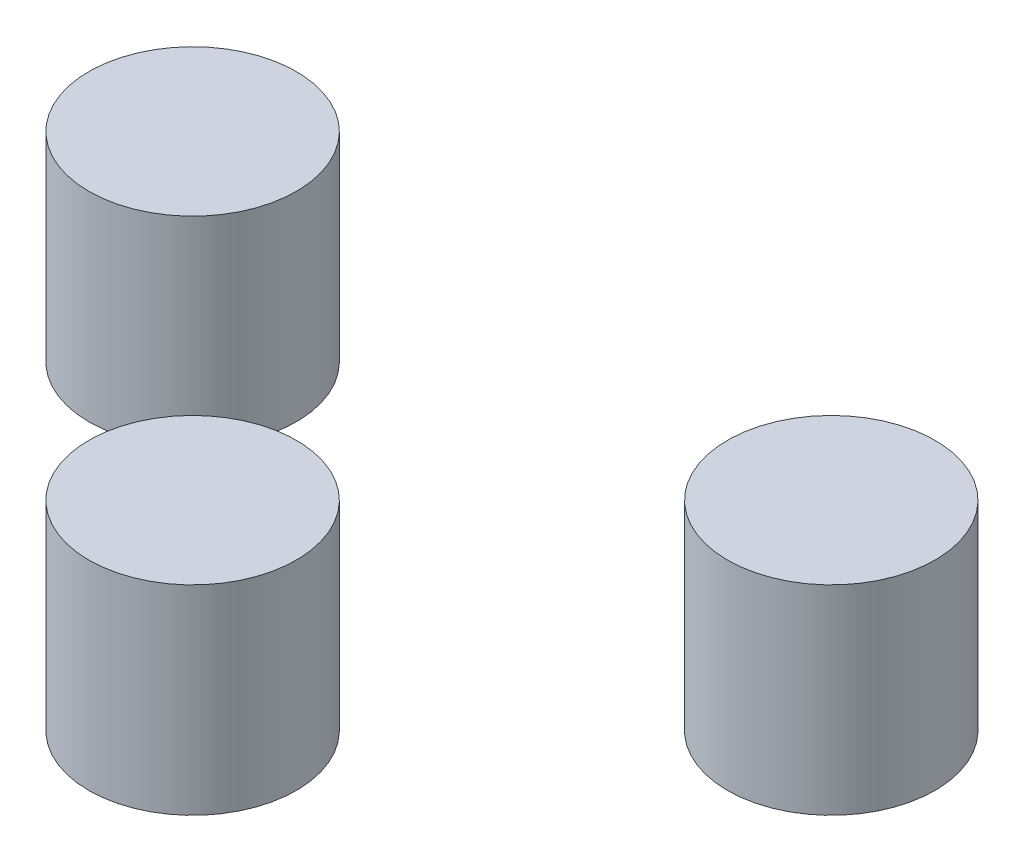
ISO-10303-21;
HEADER;
FILE_DESCRIPTION(('STEP AP214'),'2;1');
FILE_NAME('part.step','',(''),(''),'','','');
FILE_SCHEMA(('AUTOMOTIVE_DESIGN { 1 0 10303 214 1 1 1 1 }'));
ENDSEC;
DATA;
#1=APPLICATION_CONTEXT('core data for automotive mechanical design processes');
#2=APPLICATION_PROTOCOL_DEFINITION('international standard','automotive_design',2000,#1);
#3=PRODUCT_CONTEXT('',#1,'mechanical');
#4=PRODUCT('Part','Part','',(#3));
#5=PRODUCT_RELATED_PRODUCT_CATEGORY('part','',(#4));
#6=PRODUCT_DEFINITION_FORMATION('','',#4);
#7=PRODUCT_DEFINITION_CONTEXT('part definition',#1,'design');
#8=PRODUCT_DEFINITION('design','',#6,#7);
#9=PRODUCT_DEFINITION_SHAPE('','',#8);
#10=(LENGTH_UNIT() NAMED_UNIT(*) SI_UNIT(.MILLI.,.METRE.));
#11=(NAMED_UNIT(*) PLANE_ANGLE_UNIT() SI_UNIT($,.RADIAN.));
#12=(NAMED_UNIT(*) SI_UNIT($,.STERADIAN.) SOLID_ANGLE_UNIT());
#13=UNCERTAINTY_MEASURE_WITH_UNIT(LENGTH_MEASURE(1.E-05),#10,'distance_accuracy_value','');
#14=(GEOMETRIC_REPRESENTATION_CONTEXT(3) GLOBAL_UNCERTAINTY_ASSIGNED_CONTEXT((#13)) GLOBAL_UNIT_ASSIGNED_CONTEXT((#10,
#11,#12)) REPRESENTATION_CONTEXT('',''));
#15=CARTESIAN_POINT('',(0.,0.,0.));
#16=DIRECTION('',(0.,0.,1.));
#17=DIRECTION('',(1.,0.,0.));
#18=AXIS2_PLACEMENT_3D('',#15,#16,#17);
#19=CARTESIAN_POINT('',(0.,44.9999999999999,-1240.));
#20=DIRECTION('',(0.,-1.,0.));
#21=DIRECTION('',(0.,0.,-1.));
#22=AXIS2_PLACEMENT_3D('',#19,#20,#21);
#23=CYLINDRICAL_SURFACE('',#22,130.);
#24=CARTESIAN_POINT('',(0.,44.9999999999999,-1240.));
#25=DIRECTION('',(0.,1.,0.));
#26=DIRECTION('',(0.,0.,1.));
#27=AXIS2_PLACEMENT_3D('',#24,#25,#26);
#28=CIRCLE('',#27,130.);
#29=CARTESIAN_POINT('',(0.,44.9999999999999,-1110.));
#30=VERTEX_POINT('',#29);
#31=EDGE_CURVE('E11',#30,#30,#28,.T.);
#32=ORIENTED_EDGE('',*,*,#31,.F.);
#33=EDGE_LOOP('',(#32));
#34=FACE_BOUND('',#33,.T.);
#35=CARTESIAN_POINT('',(0.,-205.,-1240.));
#36=DIRECTION('',(0.,1.,0.));
#37=DIRECTION('',(0.,0.,1.));
#38=AXIS2_PLACEMENT_3D('',#35,#36,#37);
#39=CIRCLE('',#38,130.);
#40=CARTESIAN_POINT('',(0.,-205.,-1110.));
#41=VERTEX_POINT('',#40);
#42=EDGE_CURVE('E47',#41,#41,#39,.T.);
#43=ORIENTED_EDGE('',*,*,#42,.T.);
#44=EDGE_LOOP('',(#43));
#45=FACE_BOUND('',#44,.T.);
#46=ADVANCED_FACE('F46',(#34,#45),#23,.T.);
#47=CARTESIAN_POINT('',(0.,44.9999999999999,-1240.));
#48=DIRECTION('',(0.,1.,0.));
#49=DIRECTION('',(0.,0.,1.));
#50=AXIS2_PLACEMENT_3D('',#47,#48,#49);
#51=PLANE('',#50);
#52=ORIENTED_EDGE('',*,*,#31,.T.);
#53=EDGE_LOOP('',(#52));
#54=FACE_BOUND('',#53,.T.);
#55=ADVANCED_FACE('F61',(#54),#51,.T.);
#56=CARTESIAN_POINT('',(0.,-205.,-1240.));
#57=DIRECTION('',(0.,1.,0.));
#58=DIRECTION('',(0.,0.,1.));
#59=AXIS2_PLACEMENT_3D('',#56,#57,#58);
#60=PLANE('',#59);
#61=ORIENTED_EDGE('',*,*,#42,.F.);
#62=EDGE_LOOP('',(#61));
#63=FACE_BOUND('',#62,.T.);
#64=ADVANCED_FACE('F56',(#63),#60,.F.);
#65=CLOSED_SHELL('',(#46,#55,#64));
#66=MANIFOLD_SOLID_BREP('B2',#65);
#67=CARTESIAN_POINT('',(400.,44.9999999999999,-1640.));
#68=DIRECTION('',(0.,-1.,0.));
#69=DIRECTION('',(0.,0.,-1.));
#70=AXIS2_PLACEMENT_3D('',#67,#68,#69);
#71=CYLINDRICAL_SURFACE('',#70,130.);
#72=CARTESIAN_POINT('',(400.,44.9999999999999,-1640.));
#73=DIRECTION('',(0.,1.,0.));
#74=DIRECTION('',(0.,0.,1.));
#75=AXIS2_PLACEMENT_3D('',#72,#73,#74);
#76=CIRCLE('',#75,130.);
#77=CARTESIAN_POINT('',(400.,44.9999999999999,-1510.));
#78=VERTEX_POINT('',#77);
#79=EDGE_CURVE('E44',#78,#78,#76,.T.);
#80=ORIENTED_EDGE('',*,*,#79,.F.);
#81=EDGE_LOOP('',(#80));
#82=FACE_BOUND('',#81,.T.);
#83=CARTESIAN_POINT('',(400.,-205.,-1640.));
#84=DIRECTION('',(0.,1.,0.));
#85=DIRECTION('',(0.,0.,1.));
#86=AXIS2_PLACEMENT_3D('',#83,#84,#85);
#87=CIRCLE('',#86,130.);
#88=CARTESIAN_POINT('',(400.,-205.,-1510.));
#89=VERTEX_POINT('',#88);
#90=EDGE_CURVE('E100',#89,#89,#87,.T.);
#91=ORIENTED_EDGE('',*,*,#90,.T.);
#92=EDGE_LOOP('',(#91));
#93=FACE_BOUND('',#92,.T.);
#94=ADVANCED_FACE('F94',(#82,#93),#71,.T.);
#95=CARTESIAN_POINT('',(400.,44.9999999999999,-1640.));
#96=DIRECTION('',(0.,1.,0.));
#97=DIRECTION('',(0.,0.,1.));
#98=AXIS2_PLACEMENT_3D('',#95,#96,#97);
#99=PLANE('',#98);
#100=ORIENTED_EDGE('',*,*,#79,.T.);
#101=EDGE_LOOP('',(#100));
#102=FACE_BOUND('',#101,.T.);
#103=ADVANCED_FACE('F108',(#102),#99,.T.);
#104=CARTESIAN_POINT('',(400.,-205.,-1640.));
#105=DIRECTION('',(0.,1.,0.));
#106=DIRECTION('',(0.,0.,1.));
#107=AXIS2_PLACEMENT_3D('',#104,#105,#106);
#108=PLANE('',#107);
#109=ORIENTED_EDGE('',*,*,#90,.F.);
#110=EDGE_LOOP('',(#109));
#111=FACE_BOUND('',#110,.T.);
#112=ADVANCED_FACE('F110',(#111),#108,.F.);
#113=CLOSED_SHELL('',(#94,#103,#112));
#114=MANIFOLD_SOLID_BREP('B6',#113);
#115=CARTESIAN_POINT('',(-400.,44.9999999999999,-1640.));
#116=DIRECTION('',(0.,-1.,0.));
#117=DIRECTION('',(0.,0.,-1.));
#118=AXIS2_PLACEMENT_3D('',#115,#116,#117);
#119=CYLINDRICAL_SURFACE('',#118,130.);
#120=CARTESIAN_POINT('',(-400.,44.9999999999999,-1640.));
#121=DIRECTION('',(0.,1.,0.));
#122=DIRECTION('',(0.,0.,1.));
#123=AXIS2_PLACEMENT_3D('',#120,#121,#122);
#124=CIRCLE('',#123,130.);
#125=CARTESIAN_POINT('',(-400.,44.9999999999999,-1510.));
#126=VERTEX_POINT('',#125);
#127=EDGE_CURVE('E91',#126,#126,#124,.T.);
#128=ORIENTED_EDGE('',*,*,#127,.F.);
#129=EDGE_LOOP('',(#128));
#130=FACE_BOUND('',#129,.T.);
#131=CARTESIAN_POINT('',(-400.,-205.,-1640.));
#132=DIRECTION('',(0.,1.,0.));
#133=DIRECTION('',(0.,0.,1.));
#134=AXIS2_PLACEMENT_3D('',#131,#132,#133);
#135=CIRCLE('',#134,130.);
#136=CARTESIAN_POINT('',(-400.,-205.,-1510.));
#137=VERTEX_POINT('',#136);
#138=EDGE_CURVE('E139',#137,#137,#135,.T.);
#139=ORIENTED_EDGE('',*,*,#138,.T.);
#140=EDGE_LOOP('',(#139));
#141=FACE_BOUND('',#140,.T.);
#142=ADVANCED_FACE('F134',(#130,#141),#119,.T.);
#143=CARTESIAN_POINT('',(-400.,44.9999999999999,-1640.));
#144=DIRECTION('',(0.,1.,0.));
#145=DIRECTION('',(0.,0.,1.));
#146=AXIS2_PLACEMENT_3D('',#143,#144,#145);
#147=PLANE('',#146);
#148=ORIENTED_EDGE('',*,*,#127,.T.);
#149=EDGE_LOOP('',(#148));
#150=FACE_BOUND('',#149,.T.);
#151=ADVANCED_FACE('F147',(#150),#147,.T.);
#152=CARTESIAN_POINT('',(-400.,-205.,-1640.));
#153=DIRECTION('',(0.,1.,0.));
#154=DIRECTION('',(0.,0.,1.));
#155=AXIS2_PLACEMENT_3D('',#152,#153,#154);
#156=PLANE('',#155);
#157=ORIENTED_EDGE('',*,*,#138,.F.);
#158=EDGE_LOOP('',(#157));
#159=FACE_BOUND('',#158,.T.);
#160=ADVANCED_FACE('F146',(#159),#156,.F.);
#161=CLOSED_SHELL('',(#142,#151,#160));
#162=MANIFOLD_SOLID_BREP('B37',#161);
#163=ADVANCED_BREP_SHAPE_REPRESENTATION('',(#18,#66,#114,#162),#14);
#164=SHAPE_DEFINITION_REPRESENTATION(#9,#163);
ENDSEC;
END-ISO-10303-21;
